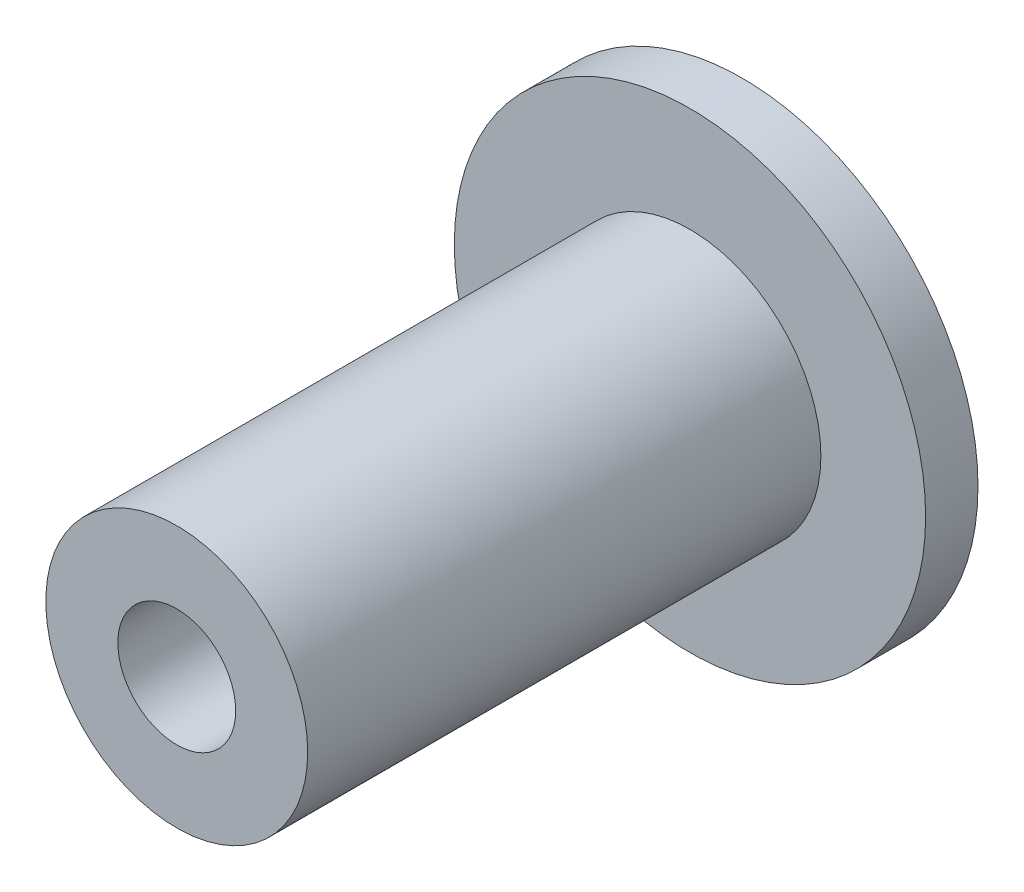
ISO-10303-21;
HEADER;
FILE_DESCRIPTION(('STEP AP214'),'2;1');
FILE_NAME('part.step','',(''),(''),'','','');
FILE_SCHEMA(('AUTOMOTIVE_DESIGN { 1 0 10303 214 1 1 1 1 }'));
ENDSEC;
DATA;
#1=APPLICATION_CONTEXT('core data for automotive mechanical design processes');
#2=APPLICATION_PROTOCOL_DEFINITION('international standard','automotive_design',2000,#1);
#3=PRODUCT_CONTEXT('',#1,'mechanical');
#4=PRODUCT('Part','Part','',(#3));
#5=PRODUCT_RELATED_PRODUCT_CATEGORY('part','',(#4));
#6=PRODUCT_DEFINITION_FORMATION('','',#4);
#7=PRODUCT_DEFINITION_CONTEXT('part definition',#1,'design');
#8=PRODUCT_DEFINITION('design','',#6,#7);
#9=PRODUCT_DEFINITION_SHAPE('','',#8);
#10=(LENGTH_UNIT() NAMED_UNIT(*) SI_UNIT(.MILLI.,.METRE.));
#11=(NAMED_UNIT(*) PLANE_ANGLE_UNIT() SI_UNIT($,.RADIAN.));
#12=(NAMED_UNIT(*) SI_UNIT($,.STERADIAN.) SOLID_ANGLE_UNIT());
#13=UNCERTAINTY_MEASURE_WITH_UNIT(LENGTH_MEASURE(1.E-05),#10,'distance_accuracy_value','');
#14=(GEOMETRIC_REPRESENTATION_CONTEXT(3) GLOBAL_UNCERTAINTY_ASSIGNED_CONTEXT((#13)) GLOBAL_UNIT_ASSIGNED_CONTEXT((#10,
#11,#12)) REPRESENTATION_CONTEXT('',''));
#15=CARTESIAN_POINT('',(0.,0.,0.));
#16=DIRECTION('',(0.,0.,1.));
#17=DIRECTION('',(1.,0.,0.));
#18=AXIS2_PLACEMENT_3D('',#15,#16,#17);
#19=CARTESIAN_POINT('',(0.,0.,-19.6));
#20=DIRECTION('',(0.,0.,1.));
#21=DIRECTION('',(1.,0.,0.));
#22=AXIS2_PLACEMENT_3D('',#19,#20,#21);
#23=CYLINDRICAL_SURFACE('',#22,5.);
#24=CARTESIAN_POINT('',(0.,0.,0.));
#25=DIRECTION('',(0.,0.,1.));
#26=DIRECTION('',(1.,0.,0.));
#27=AXIS2_PLACEMENT_3D('',#24,#25,#26);
#28=CIRCLE('',#27,5.);
#29=CARTESIAN_POINT('',(5.,0.,0.));
#30=VERTEX_POINT('',#29);
#31=EDGE_CURVE('E10',#30,#30,#28,.T.);
#32=ORIENTED_EDGE('',*,*,#31,.F.);
#33=EDGE_LOOP('',(#32));
#34=FACE_BOUND('',#33,.T.);
#35=CARTESIAN_POINT('',(0.,0.,-19.6));
#36=DIRECTION('',(0.,0.,1.));
#37=DIRECTION('',(1.,0.,0.));
#38=AXIS2_PLACEMENT_3D('',#35,#36,#37);
#39=CIRCLE('',#38,5.);
#40=CARTESIAN_POINT('',(5.,0.,-19.6));
#41=VERTEX_POINT('',#40);
#42=EDGE_CURVE('E46',#41,#41,#39,.T.);
#43=ORIENTED_EDGE('',*,*,#42,.T.);
#44=EDGE_LOOP('',(#43));
#45=FACE_BOUND('',#44,.T.);
#46=ADVANCED_FACE('F39',(#34,#45),#23,.T.);
#47=CARTESIAN_POINT('',(0.,0.,0.));
#48=DIRECTION('',(0.,0.,1.));
#49=DIRECTION('',(1.,0.,0.));
#50=AXIS2_PLACEMENT_3D('',#47,#48,#49);
#51=PLANE('',#50);
#52=CARTESIAN_POINT('',(0.,0.,0.));
#53=DIRECTION('',(0.,0.,1.));
#54=DIRECTION('',(1.,0.,0.));
#55=AXIS2_PLACEMENT_3D('',#52,#53,#54);
#56=CIRCLE('',#55,2.25);
#57=CARTESIAN_POINT('',(2.25,0.,0.));
#58=VERTEX_POINT('',#57);
#59=EDGE_CURVE('E58',#58,#58,#56,.T.);
#60=ORIENTED_EDGE('',*,*,#59,.F.);
#61=EDGE_LOOP('',(#60));
#62=FACE_BOUND('',#61,.T.);
#63=ORIENTED_EDGE('',*,*,#31,.T.);
#64=EDGE_LOOP('',(#63));
#65=FACE_BOUND('',#64,.T.);
#66=ADVANCED_FACE('F83',(#62,#65),#51,.T.);
#67=CARTESIAN_POINT('',(0.,0.,-21.6));
#68=DIRECTION('',(0.,0.,-1.));
#69=DIRECTION('',(-1.,0.,0.));
#70=AXIS2_PLACEMENT_3D('',#67,#68,#69);
#71=PLANE('',#70);
#72=CARTESIAN_POINT('',(0.,0.,-21.6));
#73=DIRECTION('',(0.,0.,-1.));
#74=DIRECTION('',(-1.,0.,0.));
#75=AXIS2_PLACEMENT_3D('',#72,#73,#74);
#76=CIRCLE('',#75,9.);
#77=CARTESIAN_POINT('',(-9.,0.,-21.6));
#78=VERTEX_POINT('',#77);
#79=EDGE_CURVE('E50',#78,#78,#76,.T.);
#80=ORIENTED_EDGE('',*,*,#79,.T.);
#81=EDGE_LOOP('',(#80));
#82=FACE_BOUND('',#81,.T.);
#83=ADVANCED_FACE('F87',(#82),#71,.T.);
#84=CARTESIAN_POINT('',(0.,0.,-19.6));
#85=DIRECTION('',(0.,0.,-1.));
#86=DIRECTION('',(-1.,0.,0.));
#87=AXIS2_PLACEMENT_3D('',#84,#85,#86);
#88=PLANE('',#87);
#89=ORIENTED_EDGE('',*,*,#42,.F.);
#90=EDGE_LOOP('',(#89));
#91=FACE_BOUND('',#90,.T.);
#92=CARTESIAN_POINT('',(0.,0.,-19.6));
#93=DIRECTION('',(0.,0.,-1.));
#94=DIRECTION('',(-1.,0.,0.));
#95=AXIS2_PLACEMENT_3D('',#92,#93,#94);
#96=CIRCLE('',#95,9.);
#97=CARTESIAN_POINT('',(-9.,0.,-19.6));
#98=VERTEX_POINT('',#97);
#99=EDGE_CURVE('E53',#98,#98,#96,.T.);
#100=ORIENTED_EDGE('',*,*,#99,.F.);
#101=EDGE_LOOP('',(#100));
#102=FACE_BOUND('',#101,.T.);
#103=ADVANCED_FACE('F78',(#91,#102),#88,.F.);
#104=CARTESIAN_POINT('',(0.,0.,-21.6));
#105=DIRECTION('',(0.,0.,1.));
#106=DIRECTION('',(1.,0.,0.));
#107=AXIS2_PLACEMENT_3D('',#104,#105,#106);
#108=CYLINDRICAL_SURFACE('',#107,9.);
#109=ORIENTED_EDGE('',*,*,#79,.F.);
#110=EDGE_LOOP('',(#109));
#111=FACE_BOUND('',#110,.T.);
#112=ORIENTED_EDGE('',*,*,#99,.T.);
#113=EDGE_LOOP('',(#112));
#114=FACE_BOUND('',#113,.T.);
#115=ADVANCED_FACE('F69',(#111,#114),#108,.T.);
#116=CARTESIAN_POINT('',(0.,0.,-6.));
#117=DIRECTION('',(0.,0.,1.));
#118=DIRECTION('',(1.,0.,0.));
#119=AXIS2_PLACEMENT_3D('',#116,#117,#118);
#120=CYLINDRICAL_SURFACE('',#119,2.25);
#121=ORIENTED_EDGE('',*,*,#59,.T.);
#122=EDGE_LOOP('',(#121));
#123=FACE_BOUND('',#122,.T.);
#124=CARTESIAN_POINT('',(0.,0.,-5.));
#125=DIRECTION('',(0.,0.,1.));
#126=DIRECTION('',(1.,0.,0.));
#127=AXIS2_PLACEMENT_3D('',#124,#125,#126);
#128=CIRCLE('',#127,2.25);
#129=CARTESIAN_POINT('',(2.25,0.,-5.));
#130=VERTEX_POINT('',#129);
#131=EDGE_CURVE('E42',#130,#130,#128,.T.);
#132=ORIENTED_EDGE('',*,*,#131,.F.);
#133=EDGE_LOOP('',(#132));
#134=FACE_BOUND('',#133,.T.);
#135=ADVANCED_FACE('F67',(#123,#134),#120,.F.);
#136=CARTESIAN_POINT('',(0.,0.,-5.));
#137=DIRECTION('',(0.,0.,1.));
#138=DIRECTION('',(1.,0.,0.));
#139=AXIS2_PLACEMENT_3D('',#136,#137,#138);
#140=PLANE('',#139);
#141=ORIENTED_EDGE('',*,*,#131,.T.);
#142=EDGE_LOOP('',(#141));
#143=FACE_BOUND('',#142,.T.);
#144=ADVANCED_FACE('F65',(#143),#140,.T.);
#145=CLOSED_SHELL('',(#46,#66,#83,#103,#115,#135,#144));
#146=MANIFOLD_SOLID_BREP('B2',#145);
#147=ADVANCED_BREP_SHAPE_REPRESENTATION('',(#18,#146),#14);
#148=SHAPE_DEFINITION_REPRESENTATION(#9,#147);
ENDSEC;
END-ISO-10303-21;
